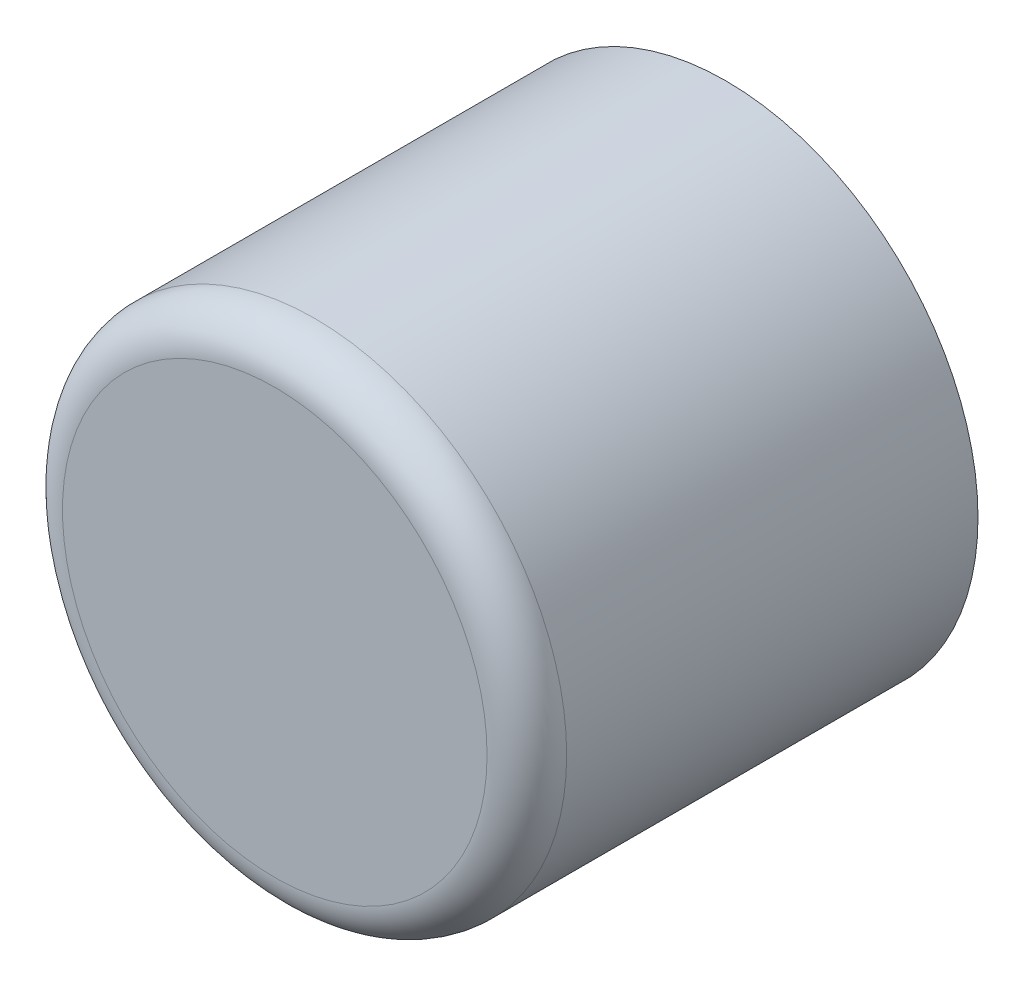
ISO-10303-21;
HEADER;
FILE_DESCRIPTION(('STEP AP214'),'2;1');
FILE_NAME('part.step','',(''),(''),'','','');
FILE_SCHEMA(('AUTOMOTIVE_DESIGN { 1 0 10303 214 1 1 1 1 }'));
ENDSEC;
DATA;
#1=APPLICATION_CONTEXT('core data for automotive mechanical design processes');
#2=APPLICATION_PROTOCOL_DEFINITION('international standard','automotive_design',2000,#1);
#3=PRODUCT_CONTEXT('',#1,'mechanical');
#4=PRODUCT('Part','Part','',(#3));
#5=PRODUCT_RELATED_PRODUCT_CATEGORY('part','',(#4));
#6=PRODUCT_DEFINITION_FORMATION('','',#4);
#7=PRODUCT_DEFINITION_CONTEXT('part definition',#1,'design');
#8=PRODUCT_DEFINITION('design','',#6,#7);
#9=PRODUCT_DEFINITION_SHAPE('','',#8);
#10=(LENGTH_UNIT() NAMED_UNIT(*) SI_UNIT(.MILLI.,.METRE.));
#11=(NAMED_UNIT(*) PLANE_ANGLE_UNIT() SI_UNIT($,.RADIAN.));
#12=(NAMED_UNIT(*) SI_UNIT($,.STERADIAN.) SOLID_ANGLE_UNIT());
#13=UNCERTAINTY_MEASURE_WITH_UNIT(LENGTH_MEASURE(1.E-05),#10,'distance_accuracy_value','');
#14=(GEOMETRIC_REPRESENTATION_CONTEXT(3) GLOBAL_UNCERTAINTY_ASSIGNED_CONTEXT((#13)) GLOBAL_UNIT_ASSIGNED_CONTEXT((#10,
#11,#12)) REPRESENTATION_CONTEXT('',''));
#15=CARTESIAN_POINT('',(0.,0.,0.));
#16=DIRECTION('',(0.,0.,1.));
#17=DIRECTION('',(1.,0.,0.));
#18=AXIS2_PLACEMENT_3D('',#15,#16,#17);
#19=CARTESIAN_POINT('',(0.,0.,34.));
#20=DIRECTION('',(0.,0.,-1.));
#21=DIRECTION('',(-1.,0.,0.));
#22=AXIS2_PLACEMENT_3D('',#19,#20,#21);
#23=CYLINDRICAL_SURFACE('',#22,19.);
#24=CARTESIAN_POINT('',(0.,0.,31.));
#25=DIRECTION('',(0.,0.,1.));
#26=DIRECTION('',(1.,0.,0.));
#27=AXIS2_PLACEMENT_3D('',#24,#25,#26);
#28=CIRCLE('',#27,19.);
#29=CARTESIAN_POINT('',(19.,0.,31.));
#30=VERTEX_POINT('',#29);
#31=EDGE_CURVE('E10',#30,#30,#28,.F.);
#32=ORIENTED_EDGE('',*,*,#31,.T.);
#33=EDGE_LOOP('',(#32));
#34=FACE_BOUND('',#33,.T.);
#35=CARTESIAN_POINT('',(0.,0.,0.));
#36=DIRECTION('',(0.,0.,1.));
#37=DIRECTION('',(1.,0.,0.));
#38=AXIS2_PLACEMENT_3D('',#35,#36,#37);
#39=CIRCLE('',#38,19.);
#40=CARTESIAN_POINT('',(19.,0.,0.));
#41=VERTEX_POINT('',#40);
#42=EDGE_CURVE('E42',#41,#41,#39,.T.);
#43=ORIENTED_EDGE('',*,*,#42,.T.);
#44=EDGE_LOOP('',(#43));
#45=FACE_BOUND('',#44,.T.);
#46=ADVANCED_FACE('F31',(#34,#45),#23,.T.);
#47=CARTESIAN_POINT('',(0.,0.,34.));
#48=DIRECTION('',(0.,0.,1.));
#49=DIRECTION('',(1.,0.,0.));
#50=AXIS2_PLACEMENT_3D('',#47,#48,#49);
#51=PLANE('',#50);
#52=CARTESIAN_POINT('',(0.,0.,34.));
#53=DIRECTION('',(0.,0.,1.));
#54=DIRECTION('',(1.,0.,0.));
#55=AXIS2_PLACEMENT_3D('',#52,#53,#54);
#56=CIRCLE('',#55,16.);
#57=CARTESIAN_POINT('',(16.,0.,34.));
#58=VERTEX_POINT('',#57);
#59=EDGE_CURVE('E38',#58,#58,#56,.T.);
#60=ORIENTED_EDGE('',*,*,#59,.T.);
#61=EDGE_LOOP('',(#60));
#62=FACE_BOUND('',#61,.T.);
#63=ADVANCED_FACE('F52',(#62),#51,.T.);
#64=CARTESIAN_POINT('',(0.,0.,0.));
#65=DIRECTION('',(0.,0.,1.));
#66=DIRECTION('',(1.,0.,0.));
#67=AXIS2_PLACEMENT_3D('',#64,#65,#66);
#68=PLANE('',#67);
#69=ORIENTED_EDGE('',*,*,#42,.F.);
#70=EDGE_LOOP('',(#69));
#71=FACE_BOUND('',#70,.T.);
#72=ADVANCED_FACE('F50',(#71),#68,.F.);
#73=CARTESIAN_POINT('',(0.,0.,31.));
#74=DIRECTION('',(0.,0.,1.));
#75=DIRECTION('',(1.,0.,0.));
#76=AXIS2_PLACEMENT_3D('',#73,#74,#75);
#77=TOROIDAL_SURFACE('',#76,16.,3.);
#78=ORIENTED_EDGE('',*,*,#31,.F.);
#79=EDGE_LOOP('',(#78));
#80=FACE_BOUND('',#79,.T.);
#81=ORIENTED_EDGE('',*,*,#59,.F.);
#82=EDGE_LOOP('',(#81));
#83=FACE_BOUND('',#82,.T.);
#84=ADVANCED_FACE('F33',(#80,#83),#77,.T.);
#85=CLOSED_SHELL('',(#46,#63,#72,#84));
#86=MANIFOLD_SOLID_BREP('B2',#85);
#87=ADVANCED_BREP_SHAPE_REPRESENTATION('',(#18,#86),#14);
#88=SHAPE_DEFINITION_REPRESENTATION(#9,#87);
ENDSEC;
END-ISO-10303-21;
